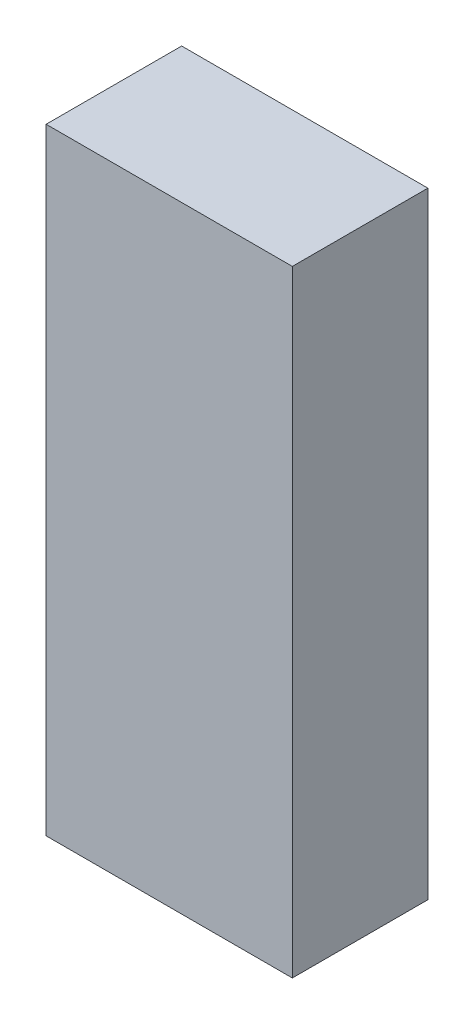
ISO-10303-21;
HEADER;
FILE_DESCRIPTION(('STEP AP214'),'2;1');
FILE_NAME('part.step','',(''),(''),'','','');
FILE_SCHEMA(('AUTOMOTIVE_DESIGN { 1 0 10303 214 1 1 1 1 }'));
ENDSEC;
DATA;
#1=APPLICATION_CONTEXT('core data for automotive mechanical design processes');
#2=APPLICATION_PROTOCOL_DEFINITION('international standard','automotive_design',2000,#1);
#3=PRODUCT_CONTEXT('',#1,'mechanical');
#4=PRODUCT('Part','Part','',(#3));
#5=PRODUCT_RELATED_PRODUCT_CATEGORY('part','',(#4));
#6=PRODUCT_DEFINITION_FORMATION('','',#4);
#7=PRODUCT_DEFINITION_CONTEXT('part definition',#1,'design');
#8=PRODUCT_DEFINITION('design','',#6,#7);
#9=PRODUCT_DEFINITION_SHAPE('','',#8);
#10=(LENGTH_UNIT() NAMED_UNIT(*) SI_UNIT(.MILLI.,.METRE.));
#11=(NAMED_UNIT(*) PLANE_ANGLE_UNIT() SI_UNIT($,.RADIAN.));
#12=(NAMED_UNIT(*) SI_UNIT($,.STERADIAN.) SOLID_ANGLE_UNIT());
#13=UNCERTAINTY_MEASURE_WITH_UNIT(LENGTH_MEASURE(1.E-05),#10,'distance_accuracy_value','');
#14=(GEOMETRIC_REPRESENTATION_CONTEXT(3) GLOBAL_UNCERTAINTY_ASSIGNED_CONTEXT((#13)) GLOBAL_UNIT_ASSIGNED_CONTEXT((#10,
#11,#12)) REPRESENTATION_CONTEXT('',''));
#15=CARTESIAN_POINT('',(0.,0.,0.));
#16=DIRECTION('',(0.,0.,1.));
#17=DIRECTION('',(1.,0.,0.));
#18=AXIS2_PLACEMENT_3D('',#15,#16,#17);
#19=CARTESIAN_POINT('',(0.,0.,15.24));
#20=DIRECTION('',(1.,0.,0.));
#21=DIRECTION('',(0.,0.,-1.));
#22=AXIS2_PLACEMENT_3D('',#19,#20,#21);
#23=PLANE('',#22);
#24=DIRECTION('',(0.,-1.,0.));
#25=VECTOR('',#24,1.);
#26=CARTESIAN_POINT('',(0.,0.,0.));
#27=LINE('',#26,#25);
#28=CARTESIAN_POINT('',(0.,69.3,0.));
#29=VERTEX_POINT('',#28);
#30=CARTESIAN_POINT('',(0.,0.,0.));
#31=VERTEX_POINT('',#30);
#32=EDGE_CURVE('E96',#29,#31,#27,.T.);
#33=ORIENTED_EDGE('',*,*,#32,.T.);
#34=DIRECTION('',(0.,0.,-1.));
#35=VECTOR('',#34,1.);
#36=CARTESIAN_POINT('',(0.,0.,15.24));
#37=LINE('',#36,#35);
#38=CARTESIAN_POINT('',(0.,0.,15.24));
#39=VERTEX_POINT('',#38);
#40=EDGE_CURVE('E11',#39,#31,#37,.T.);
#41=ORIENTED_EDGE('',*,*,#40,.F.);
#42=DIRECTION('',(0.,-1.,0.));
#43=VECTOR('',#42,1.);
#44=CARTESIAN_POINT('',(0.,0.,15.24));
#45=LINE('',#44,#43);
#46=CARTESIAN_POINT('',(0.,69.3,15.24));
#47=VERTEX_POINT('',#46);
#48=EDGE_CURVE('E84',#47,#39,#45,.T.);
#49=ORIENTED_EDGE('',*,*,#48,.F.);
#50=DIRECTION('',(0.,0.,-1.));
#51=VECTOR('',#50,1.);
#52=CARTESIAN_POINT('',(0.,69.3,15.24));
#53=LINE('',#52,#51);
#54=EDGE_CURVE('E92',#47,#29,#53,.T.);
#55=ORIENTED_EDGE('',*,*,#54,.T.);
#56=EDGE_LOOP('',(#33,#41,#49,#55));
#57=FACE_BOUND('',#56,.T.);
#58=ADVANCED_FACE('F33',(#57),#23,.F.);
#59=CARTESIAN_POINT('',(0.,0.,15.24));
#60=DIRECTION('',(0.,1.,0.));
#61=DIRECTION('',(0.,0.,1.));
#62=AXIS2_PLACEMENT_3D('',#59,#60,#61);
#63=PLANE('',#62);
#64=DIRECTION('',(1.,0.,0.));
#65=VECTOR('',#64,1.);
#66=CARTESIAN_POINT('',(0.,0.,0.));
#67=LINE('',#66,#65);
#68=CARTESIAN_POINT('',(27.686,0.,0.));
#69=VERTEX_POINT('',#68);
#70=EDGE_CURVE('E88',#31,#69,#67,.T.);
#71=ORIENTED_EDGE('',*,*,#70,.T.);
#72=DIRECTION('',(0.,0.,-1.));
#73=VECTOR('',#72,1.);
#74=CARTESIAN_POINT('',(27.686,0.,15.24));
#75=LINE('',#74,#73);
#76=CARTESIAN_POINT('',(27.686,0.,15.24));
#77=VERTEX_POINT('',#76);
#78=EDGE_CURVE('E41',#77,#69,#75,.T.);
#79=ORIENTED_EDGE('',*,*,#78,.F.);
#80=DIRECTION('',(1.,0.,0.));
#81=VECTOR('',#80,1.);
#82=CARTESIAN_POINT('',(0.,0.,15.24));
#83=LINE('',#82,#81);
#84=EDGE_CURVE('E79',#39,#77,#83,.T.);
#85=ORIENTED_EDGE('',*,*,#84,.F.);
#86=ORIENTED_EDGE('',*,*,#40,.T.);
#87=EDGE_LOOP('',(#71,#79,#85,#86));
#88=FACE_BOUND('',#87,.T.);
#89=ADVANCED_FACE('F87',(#88),#63,.F.);
#90=CARTESIAN_POINT('',(27.686,0.,15.24));
#91=DIRECTION('',(-1.,0.,0.));
#92=DIRECTION('',(0.,-1.,0.));
#93=AXIS2_PLACEMENT_3D('',#90,#91,#92);
#94=PLANE('',#93);
#95=DIRECTION('',(0.,1.,0.));
#96=VECTOR('',#95,1.);
#97=CARTESIAN_POINT('',(27.686,0.,0.));
#98=LINE('',#97,#96);
#99=CARTESIAN_POINT('',(27.686,69.3,0.));
#100=VERTEX_POINT('',#99);
#101=EDGE_CURVE('E66',#69,#100,#98,.T.);
#102=ORIENTED_EDGE('',*,*,#101,.T.);
#103=DIRECTION('',(0.,0.,-1.));
#104=VECTOR('',#103,1.);
#105=CARTESIAN_POINT('',(27.686,69.3,15.24));
#106=LINE('',#105,#104);
#107=CARTESIAN_POINT('',(27.686,69.3,15.24));
#108=VERTEX_POINT('',#107);
#109=EDGE_CURVE('E89',#108,#100,#106,.T.);
#110=ORIENTED_EDGE('',*,*,#109,.F.);
#111=DIRECTION('',(0.,1.,0.));
#112=VECTOR('',#111,1.);
#113=CARTESIAN_POINT('',(27.686,0.,15.24));
#114=LINE('',#113,#112);
#115=EDGE_CURVE('E82',#77,#108,#114,.T.);
#116=ORIENTED_EDGE('',*,*,#115,.F.);
#117=ORIENTED_EDGE('',*,*,#78,.T.);
#118=EDGE_LOOP('',(#102,#110,#116,#117));
#119=FACE_BOUND('',#118,.T.);
#120=ADVANCED_FACE('F90',(#119),#94,.F.);
#121=CARTESIAN_POINT('',(0.,69.3,15.24));
#122=DIRECTION('',(0.,-1.,0.));
#123=DIRECTION('',(1.,0.,0.));
#124=AXIS2_PLACEMENT_3D('',#121,#122,#123);
#125=PLANE('',#124);
#126=DIRECTION('',(-1.,0.,0.));
#127=VECTOR('',#126,1.);
#128=CARTESIAN_POINT('',(0.,69.3,0.));
#129=LINE('',#128,#127);
#130=EDGE_CURVE('E72',#100,#29,#129,.T.);
#131=ORIENTED_EDGE('',*,*,#130,.T.);
#132=ORIENTED_EDGE('',*,*,#54,.F.);
#133=DIRECTION('',(-1.,0.,0.));
#134=VECTOR('',#133,1.);
#135=CARTESIAN_POINT('',(0.,69.3,15.24));
#136=LINE('',#135,#134);
#137=EDGE_CURVE('E49',#108,#47,#136,.T.);
#138=ORIENTED_EDGE('',*,*,#137,.F.);
#139=ORIENTED_EDGE('',*,*,#109,.T.);
#140=EDGE_LOOP('',(#131,#132,#138,#139));
#141=FACE_BOUND('',#140,.T.);
#142=ADVANCED_FACE('F103',(#141),#125,.F.);
#143=CARTESIAN_POINT('',(0.,0.,15.24));
#144=DIRECTION('',(0.,0.,-1.));
#145=DIRECTION('',(-1.,0.,0.));
#146=AXIS2_PLACEMENT_3D('',#143,#144,#145);
#147=PLANE('',#146);
#148=ORIENTED_EDGE('',*,*,#48,.T.);
#149=ORIENTED_EDGE('',*,*,#84,.T.);
#150=ORIENTED_EDGE('',*,*,#115,.T.);
#151=ORIENTED_EDGE('',*,*,#137,.T.);
#152=EDGE_LOOP('',(#148,#149,#150,#151));
#153=FACE_BOUND('',#152,.T.);
#154=ADVANCED_FACE('F80',(#153),#147,.F.);
#155=CARTESIAN_POINT('',(0.,0.,0.));
#156=DIRECTION('',(0.,0.,-1.));
#157=DIRECTION('',(-1.,0.,0.));
#158=AXIS2_PLACEMENT_3D('',#155,#156,#157);
#159=PLANE('',#158);
#160=ORIENTED_EDGE('',*,*,#32,.F.);
#161=ORIENTED_EDGE('',*,*,#130,.F.);
#162=ORIENTED_EDGE('',*,*,#101,.F.);
#163=ORIENTED_EDGE('',*,*,#70,.F.);
#164=EDGE_LOOP('',(#160,#161,#162,#163));
#165=FACE_BOUND('',#164,.T.);
#166=ADVANCED_FACE('F106',(#165),#159,.T.);
#167=CLOSED_SHELL('',(#58,#89,#120,#142,#154,#166));
#168=MANIFOLD_SOLID_BREP('B2',#167);
#169=ADVANCED_BREP_SHAPE_REPRESENTATION('',(#18,#168),#14);
#170=SHAPE_DEFINITION_REPRESENTATION(#9,#169);
ENDSEC;
END-ISO-10303-21;
